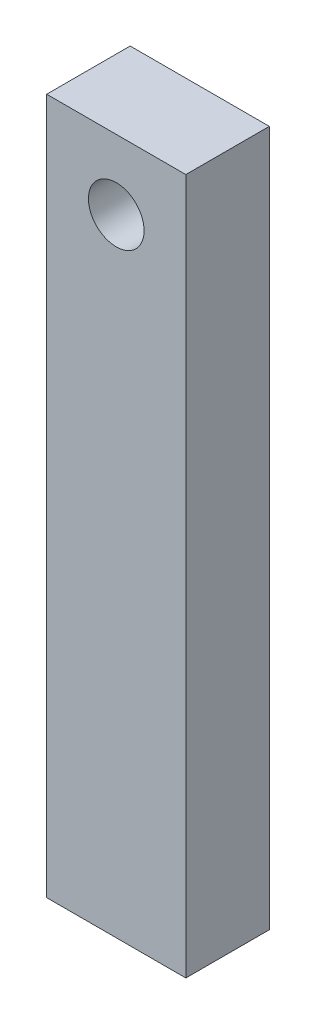
ISO-10303-21;
HEADER;
FILE_DESCRIPTION(('STEP AP214'),'2;1');
FILE_NAME('part.step','',(''),(''),'','','');
FILE_SCHEMA(('AUTOMOTIVE_DESIGN { 1 0 10303 214 1 1 1 1 }'));
ENDSEC;
DATA;
#1=APPLICATION_CONTEXT('core data for automotive mechanical design processes');
#2=APPLICATION_PROTOCOL_DEFINITION('international standard','automotive_design',2000,#1);
#3=PRODUCT_CONTEXT('',#1,'mechanical');
#4=PRODUCT('Part','Part','',(#3));
#5=PRODUCT_RELATED_PRODUCT_CATEGORY('part','',(#4));
#6=PRODUCT_DEFINITION_FORMATION('','',#4);
#7=PRODUCT_DEFINITION_CONTEXT('part definition',#1,'design');
#8=PRODUCT_DEFINITION('design','',#6,#7);
#9=PRODUCT_DEFINITION_SHAPE('','',#8);
#10=(LENGTH_UNIT() NAMED_UNIT(*) SI_UNIT(.MILLI.,.METRE.));
#11=(NAMED_UNIT(*) PLANE_ANGLE_UNIT() SI_UNIT($,.RADIAN.));
#12=(NAMED_UNIT(*) SI_UNIT($,.STERADIAN.) SOLID_ANGLE_UNIT());
#13=UNCERTAINTY_MEASURE_WITH_UNIT(LENGTH_MEASURE(1.E-05),#10,'distance_accuracy_value','');
#14=(GEOMETRIC_REPRESENTATION_CONTEXT(3) GLOBAL_UNCERTAINTY_ASSIGNED_CONTEXT((#13)) GLOBAL_UNIT_ASSIGNED_CONTEXT((#10,
#11,#12)) REPRESENTATION_CONTEXT('',''));
#15=CARTESIAN_POINT('',(0.,0.,0.));
#16=DIRECTION('',(0.,0.,1.));
#17=DIRECTION('',(1.,0.,0.));
#18=AXIS2_PLACEMENT_3D('',#15,#16,#17);
#19=CARTESIAN_POINT('',(4.49324324324323,0.,6.));
#20=DIRECTION('',(-1.,0.,0.));
#21=DIRECTION('',(0.,0.,1.));
#22=AXIS2_PLACEMENT_3D('',#19,#20,#21);
#23=PLANE('',#22);
#24=DIRECTION('',(0.,1.,0.));
#25=VECTOR('',#24,1.);
#26=CARTESIAN_POINT('',(4.49324324324323,0.,0.));
#27=LINE('',#26,#25);
#28=CARTESIAN_POINT('',(4.49324324324323,0.,0.));
#29=VERTEX_POINT('',#28);
#30=CARTESIAN_POINT('',(4.49324324324323,50.,0.));
#31=VERTEX_POINT('',#30);
#32=EDGE_CURVE('E111',#29,#31,#27,.T.);
#33=ORIENTED_EDGE('',*,*,#32,.T.);
#34=DIRECTION('',(0.,0.,-1.));
#35=VECTOR('',#34,1.);
#36=CARTESIAN_POINT('',(4.49324324324323,50.,6.));
#37=LINE('',#36,#35);
#38=CARTESIAN_POINT('',(4.49324324324323,50.,6.));
#39=VERTEX_POINT('',#38);
#40=EDGE_CURVE('E11',#39,#31,#37,.T.);
#41=ORIENTED_EDGE('',*,*,#40,.F.);
#42=DIRECTION('',(0.,1.,0.));
#43=VECTOR('',#42,1.);
#44=CARTESIAN_POINT('',(4.49324324324323,0.,6.));
#45=LINE('',#44,#43);
#46=CARTESIAN_POINT('',(4.49324324324323,0.,6.));
#47=VERTEX_POINT('',#46);
#48=EDGE_CURVE('E94',#47,#39,#45,.T.);
#49=ORIENTED_EDGE('',*,*,#48,.F.);
#50=DIRECTION('',(0.,0.,-1.));
#51=VECTOR('',#50,1.);
#52=CARTESIAN_POINT('',(4.49324324324323,0.,6.));
#53=LINE('',#52,#51);
#54=EDGE_CURVE('E107',#47,#29,#53,.T.);
#55=ORIENTED_EDGE('',*,*,#54,.T.);
#56=EDGE_LOOP('',(#33,#41,#49,#55));
#57=FACE_BOUND('',#56,.T.);
#58=ADVANCED_FACE('F42',(#57),#23,.F.);
#59=CARTESIAN_POINT('',(4.49324324324323,50.,6.));
#60=DIRECTION('',(0.,-1.,0.));
#61=DIRECTION('',(0.,0.,-1.));
#62=AXIS2_PLACEMENT_3D('',#59,#60,#61);
#63=PLANE('',#62);
#64=DIRECTION('',(-1.,0.,0.));
#65=VECTOR('',#64,1.);
#66=CARTESIAN_POINT('',(4.49324324324323,50.,0.));
#67=LINE('',#66,#65);
#68=CARTESIAN_POINT('',(-5.50675675675677,50.,0.));
#69=VERTEX_POINT('',#68);
#70=EDGE_CURVE('E99',#31,#69,#67,.T.);
#71=ORIENTED_EDGE('',*,*,#70,.T.);
#72=DIRECTION('',(0.,0.,-1.));
#73=VECTOR('',#72,1.);
#74=CARTESIAN_POINT('',(-5.50675675675677,50.,6.));
#75=LINE('',#74,#73);
#76=CARTESIAN_POINT('',(-5.50675675675677,50.,6.));
#77=VERTEX_POINT('',#76);
#78=EDGE_CURVE('E51',#77,#69,#75,.T.);
#79=ORIENTED_EDGE('',*,*,#78,.F.);
#80=DIRECTION('',(-1.,0.,0.));
#81=VECTOR('',#80,1.);
#82=CARTESIAN_POINT('',(4.49324324324323,50.,6.));
#83=LINE('',#82,#81);
#84=EDGE_CURVE('E89',#39,#77,#83,.T.);
#85=ORIENTED_EDGE('',*,*,#84,.F.);
#86=ORIENTED_EDGE('',*,*,#40,.T.);
#87=EDGE_LOOP('',(#71,#79,#85,#86));
#88=FACE_BOUND('',#87,.T.);
#89=ADVANCED_FACE('F98',(#88),#63,.F.);
#90=CARTESIAN_POINT('',(-5.50675675675677,0.,6.));
#91=DIRECTION('',(1.,0.,0.));
#92=DIRECTION('',(0.,1.,0.));
#93=AXIS2_PLACEMENT_3D('',#90,#91,#92);
#94=PLANE('',#93);
#95=DIRECTION('',(0.,-1.,0.));
#96=VECTOR('',#95,1.);
#97=CARTESIAN_POINT('',(-5.50675675675677,0.,0.));
#98=LINE('',#97,#96);
#99=CARTESIAN_POINT('',(-5.50675675675677,0.,0.));
#100=VERTEX_POINT('',#99);
#101=EDGE_CURVE('E76',#69,#100,#98,.T.);
#102=ORIENTED_EDGE('',*,*,#101,.T.);
#103=DIRECTION('',(0.,0.,-1.));
#104=VECTOR('',#103,1.);
#105=CARTESIAN_POINT('',(-5.50675675675677,0.,6.));
#106=LINE('',#105,#104);
#107=CARTESIAN_POINT('',(-5.50675675675677,0.,6.));
#108=VERTEX_POINT('',#107);
#109=EDGE_CURVE('E101',#108,#100,#106,.T.);
#110=ORIENTED_EDGE('',*,*,#109,.F.);
#111=DIRECTION('',(0.,-1.,0.));
#112=VECTOR('',#111,1.);
#113=CARTESIAN_POINT('',(-5.50675675675677,0.,6.));
#114=LINE('',#113,#112);
#115=EDGE_CURVE('E92',#77,#108,#114,.T.);
#116=ORIENTED_EDGE('',*,*,#115,.F.);
#117=ORIENTED_EDGE('',*,*,#78,.T.);
#118=EDGE_LOOP('',(#102,#110,#116,#117));
#119=FACE_BOUND('',#118,.T.);
#120=ADVANCED_FACE('F102',(#119),#94,.F.);
#121=CARTESIAN_POINT('',(4.49324324324323,0.,6.));
#122=DIRECTION('',(0.,1.,0.));
#123=DIRECTION('',(0.,0.,1.));
#124=AXIS2_PLACEMENT_3D('',#121,#122,#123);
#125=PLANE('',#124);
#126=DIRECTION('',(1.,0.,0.));
#127=VECTOR('',#126,1.);
#128=CARTESIAN_POINT('',(4.49324324324323,0.,0.));
#129=LINE('',#128,#127);
#130=EDGE_CURVE('E82',#100,#29,#129,.T.);
#131=ORIENTED_EDGE('',*,*,#130,.T.);
#132=ORIENTED_EDGE('',*,*,#54,.F.);
#133=DIRECTION('',(1.,0.,0.));
#134=VECTOR('',#133,1.);
#135=CARTESIAN_POINT('',(4.49324324324323,0.,6.));
#136=LINE('',#135,#134);
#137=EDGE_CURVE('E59',#108,#47,#136,.T.);
#138=ORIENTED_EDGE('',*,*,#137,.F.);
#139=ORIENTED_EDGE('',*,*,#109,.T.);
#140=EDGE_LOOP('',(#131,#132,#138,#139));
#141=FACE_BOUND('',#140,.T.);
#142=ADVANCED_FACE('F126',(#141),#125,.F.);
#143=CARTESIAN_POINT('',(0.,0.,6.));
#144=DIRECTION('',(0.,0.,1.));
#145=DIRECTION('',(1.,0.,0.));
#146=AXIS2_PLACEMENT_3D('',#143,#144,#145);
#147=PLANE('',#146);
#148=CARTESIAN_POINT('',(-0.506756756756773,45.,6.));
#149=DIRECTION('',(0.,0.,1.));
#150=DIRECTION('',(1.,0.,0.));
#151=AXIS2_PLACEMENT_3D('',#148,#149,#150);
#152=CIRCLE('',#151,2.);
#153=CARTESIAN_POINT('',(1.49324324324323,45.,6.));
#154=VERTEX_POINT('',#153);
#155=EDGE_CURVE('E134',#154,#154,#152,.T.);
#156=ORIENTED_EDGE('',*,*,#155,.F.);
#157=EDGE_LOOP('',(#156));
#158=FACE_BOUND('',#157,.T.);
#159=ORIENTED_EDGE('',*,*,#48,.T.);
#160=ORIENTED_EDGE('',*,*,#84,.T.);
#161=ORIENTED_EDGE('',*,*,#115,.T.);
#162=ORIENTED_EDGE('',*,*,#137,.T.);
#163=EDGE_LOOP('',(#159,#160,#161,#162));
#164=FACE_BOUND('',#163,.T.);
#165=ADVANCED_FACE('F90',(#158,#164),#147,.T.);
#166=CARTESIAN_POINT('',(0.,0.,0.));
#167=DIRECTION('',(0.,0.,1.));
#168=DIRECTION('',(1.,0.,0.));
#169=AXIS2_PLACEMENT_3D('',#166,#167,#168);
#170=PLANE('',#169);
#171=CARTESIAN_POINT('',(-0.506756756756773,45.,0.));
#172=DIRECTION('',(0.,0.,1.));
#173=DIRECTION('',(1.,0.,0.));
#174=AXIS2_PLACEMENT_3D('',#171,#172,#173);
#175=CIRCLE('',#174,2.);
#176=CARTESIAN_POINT('',(1.49324324324323,45.,0.));
#177=VERTEX_POINT('',#176);
#178=EDGE_CURVE('E115',#177,#177,#175,.T.);
#179=ORIENTED_EDGE('',*,*,#178,.T.);
#180=EDGE_LOOP('',(#179));
#181=FACE_BOUND('',#180,.T.);
#182=ORIENTED_EDGE('',*,*,#32,.F.);
#183=ORIENTED_EDGE('',*,*,#130,.F.);
#184=ORIENTED_EDGE('',*,*,#101,.F.);
#185=ORIENTED_EDGE('',*,*,#70,.F.);
#186=EDGE_LOOP('',(#182,#183,#184,#185));
#187=FACE_BOUND('',#186,.T.);
#188=ADVANCED_FACE('F129',(#181,#187),#170,.F.);
#189=CARTESIAN_POINT('',(-0.506756756756773,45.,0.));
#190=DIRECTION('',(0.,0.,1.));
#191=DIRECTION('',(1.,0.,0.));
#192=AXIS2_PLACEMENT_3D('',#189,#190,#191);
#193=CYLINDRICAL_SURFACE('',#192,2.);
#194=ORIENTED_EDGE('',*,*,#178,.F.);
#195=EDGE_LOOP('',(#194));
#196=FACE_BOUND('',#195,.T.);
#197=ORIENTED_EDGE('',*,*,#155,.T.);
#198=EDGE_LOOP('',(#197));
#199=FACE_BOUND('',#198,.T.);
#200=ADVANCED_FACE('F144',(#196,#199),#193,.F.);
#201=CLOSED_SHELL('',(#58,#89,#120,#142,#165,#188,#200));
#202=MANIFOLD_SOLID_BREP('B2',#201);
#203=ADVANCED_BREP_SHAPE_REPRESENTATION('',(#18,#202),#14);
#204=SHAPE_DEFINITION_REPRESENTATION(#9,#203);
ENDSEC;
END-ISO-10303-21;
